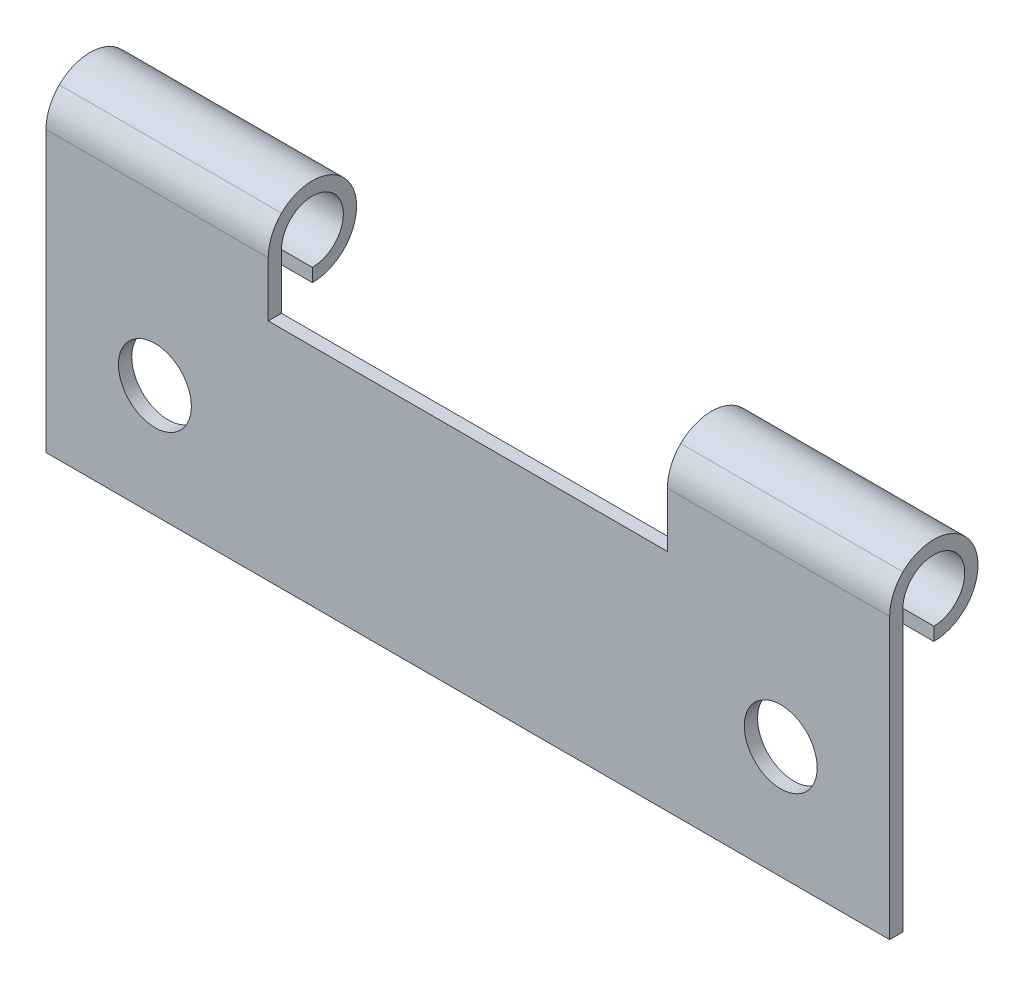
ISO-10303-21;
HEADER;
FILE_DESCRIPTION(('STEP AP214'),'2;1');
FILE_NAME('part.step','',(''),(''),'','','');
FILE_SCHEMA(('AUTOMOTIVE_DESIGN { 1 0 10303 214 1 1 1 1 }'));
ENDSEC;
DATA;
#1=APPLICATION_CONTEXT('core data for automotive mechanical design processes');
#2=APPLICATION_PROTOCOL_DEFINITION('international standard','automotive_design',2000,#1);
#3=PRODUCT_CONTEXT('',#1,'mechanical');
#4=PRODUCT('Part','Part','',(#3));
#5=PRODUCT_RELATED_PRODUCT_CATEGORY('part','',(#4));
#6=PRODUCT_DEFINITION_FORMATION('','',#4);
#7=PRODUCT_DEFINITION_CONTEXT('part definition',#1,'design');
#8=PRODUCT_DEFINITION('design','',#6,#7);
#9=PRODUCT_DEFINITION_SHAPE('','',#8);
#10=(LENGTH_UNIT() NAMED_UNIT(*) SI_UNIT(.MILLI.,.METRE.));
#11=(NAMED_UNIT(*) PLANE_ANGLE_UNIT() SI_UNIT($,.RADIAN.));
#12=(NAMED_UNIT(*) SI_UNIT($,.STERADIAN.) SOLID_ANGLE_UNIT());
#13=UNCERTAINTY_MEASURE_WITH_UNIT(LENGTH_MEASURE(1.E-05),#10,'distance_accuracy_value','');
#14=(GEOMETRIC_REPRESENTATION_CONTEXT(3) GLOBAL_UNCERTAINTY_ASSIGNED_CONTEXT((#13)) GLOBAL_UNIT_ASSIGNED_CONTEXT((#10,
#11,#12)) REPRESENTATION_CONTEXT('',''));
#15=CARTESIAN_POINT('',(0.,0.,0.));
#16=DIRECTION('',(0.,0.,1.));
#17=DIRECTION('',(1.,0.,0.));
#18=AXIS2_PLACEMENT_3D('',#15,#16,#17);
#19=CARTESIAN_POINT('',(0.,0.,0.));
#20=DIRECTION('',(0.,0.,1.));
#21=DIRECTION('',(1.,0.,0.));
#22=AXIS2_PLACEMENT_3D('',#19,#20,#21);
#23=PLANE('',#22);
#24=CARTESIAN_POINT('',(33.26,-5.095,0.));
#25=DIRECTION('',(0.,0.,-1.));
#26=DIRECTION('',(-1.,0.,0.));
#27=AXIS2_PLACEMENT_3D('',#24,#25,#26);
#28=CIRCLE('',#27,1.65);
#29=CARTESIAN_POINT('',(31.61,-5.095,0.));
#30=VERTEX_POINT('',#29);
#31=EDGE_CURVE('E189',#30,#30,#28,.T.);
#32=ORIENTED_EDGE('',*,*,#31,.F.);
#33=EDGE_LOOP('',(#32));
#34=FACE_BOUND('',#33,.T.);
#35=CARTESIAN_POINT('',(4.93,-5.095,0.));
#36=DIRECTION('',(0.,0.,-1.));
#37=DIRECTION('',(-1.,0.,0.));
#38=AXIS2_PLACEMENT_3D('',#35,#36,#37);
#39=CIRCLE('',#38,1.65);
#40=CARTESIAN_POINT('',(3.28,-5.095,0.));
#41=VERTEX_POINT('',#40);
#42=EDGE_CURVE('E194',#41,#41,#39,.T.);
#43=ORIENTED_EDGE('',*,*,#42,.F.);
#44=EDGE_LOOP('',(#43));
#45=FACE_BOUND('',#44,.T.);
#46=DIRECTION('',(0.,-1.,0.));
#47=VECTOR('',#46,1.);
#48=CARTESIAN_POINT('',(0.,0.,0.));
#49=LINE('',#48,#47);
#50=CARTESIAN_POINT('',(0.,2.5,0.));
#51=VERTEX_POINT('',#50);
#52=CARTESIAN_POINT('',(0.,-10.19,0.));
#53=VERTEX_POINT('',#52);
#54=EDGE_CURVE('E55',#51,#53,#49,.T.);
#55=ORIENTED_EDGE('',*,*,#54,.F.);
#56=DIRECTION('',(-1.,0.,0.));
#57=VECTOR('',#56,1.);
#58=CARTESIAN_POINT('',(15.7168542494924,2.5,0.));
#59=LINE('',#58,#57);
#60=CARTESIAN_POINT('',(10.06,2.5,0.));
#61=VERTEX_POINT('',#60);
#62=EDGE_CURVE('E223',#61,#51,#59,.T.);
#63=ORIENTED_EDGE('',*,*,#62,.F.);
#64=DIRECTION('',(0.,-1.,0.));
#65=VECTOR('',#64,1.);
#66=CARTESIAN_POINT('',(10.06,4.5,0.));
#67=LINE('',#66,#65);
#68=CARTESIAN_POINT('',(10.06,0.,0.));
#69=VERTEX_POINT('',#68);
#70=EDGE_CURVE('E262',#61,#69,#67,.T.);
#71=ORIENTED_EDGE('',*,*,#70,.T.);
#72=DIRECTION('',(-1.,0.,0.));
#73=VECTOR('',#72,1.);
#74=CARTESIAN_POINT('',(0.,0.,0.));
#75=LINE('',#74,#73);
#76=CARTESIAN_POINT('',(28.13,0.,0.));
#77=VERTEX_POINT('',#76);
#78=EDGE_CURVE('E184',#77,#69,#75,.T.);
#79=ORIENTED_EDGE('',*,*,#78,.F.);
#80=DIRECTION('',(0.,-1.,0.));
#81=VECTOR('',#80,1.);
#82=CARTESIAN_POINT('',(28.13,4.5,0.));
#83=LINE('',#82,#81);
#84=CARTESIAN_POINT('',(28.13,2.5,0.));
#85=VERTEX_POINT('',#84);
#86=EDGE_CURVE('E257',#85,#77,#83,.T.);
#87=ORIENTED_EDGE('',*,*,#86,.F.);
#88=DIRECTION('',(1.,0.,0.));
#89=VECTOR('',#88,1.);
#90=CARTESIAN_POINT('',(22.4731457505076,2.5,0.));
#91=LINE('',#90,#89);
#92=CARTESIAN_POINT('',(38.19,2.5,0.));
#93=VERTEX_POINT('',#92);
#94=EDGE_CURVE('E234',#85,#93,#91,.T.);
#95=ORIENTED_EDGE('',*,*,#94,.T.);
#96=DIRECTION('',(0.,1.,0.));
#97=VECTOR('',#96,1.);
#98=CARTESIAN_POINT('',(38.19,0.,0.));
#99=LINE('',#98,#97);
#100=CARTESIAN_POINT('',(38.19,-10.19,0.));
#101=VERTEX_POINT('',#100);
#102=EDGE_CURVE('E181',#101,#93,#99,.T.);
#103=ORIENTED_EDGE('',*,*,#102,.F.);
#104=DIRECTION('',(1.,0.,0.));
#105=VECTOR('',#104,1.);
#106=CARTESIAN_POINT('',(0.,-10.19,0.));
#107=LINE('',#106,#105);
#108=EDGE_CURVE('E178',#53,#101,#107,.T.);
#109=ORIENTED_EDGE('',*,*,#108,.F.);
#110=EDGE_LOOP('',(#55,#63,#71,#79,#87,#95,#103,#109));
#111=FACE_BOUND('',#110,.T.);
#112=ADVANCED_FACE('F38',(#34,#45,#111),#23,.F.);
#113=CARTESIAN_POINT('',(0.,0.,0.6));
#114=DIRECTION('',(0.,-1.,0.));
#115=DIRECTION('',(0.,0.,-1.));
#116=AXIS2_PLACEMENT_3D('',#113,#114,#115);
#117=PLANE('',#116);
#118=DIRECTION('',(0.,0.,1.));
#119=VECTOR('',#118,1.);
#120=CARTESIAN_POINT('',(28.13,0.,0.600000000000001));
#121=LINE('',#120,#119);
#122=CARTESIAN_POINT('',(28.13,0.,0.6));
#123=VERTEX_POINT('',#122);
#124=EDGE_CURVE('E252',#77,#123,#121,.T.);
#125=ORIENTED_EDGE('',*,*,#124,.F.);
#126=ORIENTED_EDGE('',*,*,#78,.T.);
#127=DIRECTION('',(0.,0.,-1.));
#128=VECTOR('',#127,1.);
#129=CARTESIAN_POINT('',(10.06,0.,0.));
#130=LINE('',#129,#128);
#131=CARTESIAN_POINT('',(10.06,0.,0.6));
#132=VERTEX_POINT('',#131);
#133=EDGE_CURVE('E259',#132,#69,#130,.T.);
#134=ORIENTED_EDGE('',*,*,#133,.F.);
#135=DIRECTION('',(-1.,0.,0.));
#136=VECTOR('',#135,1.);
#137=CARTESIAN_POINT('',(0.,0.,0.6));
#138=LINE('',#137,#136);
#139=EDGE_CURVE('E169',#123,#132,#138,.T.);
#140=ORIENTED_EDGE('',*,*,#139,.F.);
#141=EDGE_LOOP('',(#125,#126,#134,#140));
#142=FACE_BOUND('',#141,.T.);
#143=ADVANCED_FACE('F294',(#142),#117,.F.);
#144=CARTESIAN_POINT('',(0.,0.,0.6));
#145=DIRECTION('',(1.,0.,0.));
#146=DIRECTION('',(0.,0.,-1.));
#147=AXIS2_PLACEMENT_3D('',#144,#145,#146);
#148=PLANE('',#147);
#149=DIRECTION('',(0.,-1.,0.));
#150=VECTOR('',#149,1.);
#151=CARTESIAN_POINT('',(0.,0.,0.6));
#152=LINE('',#151,#150);
#153=CARTESIAN_POINT('',(0.,2.4766643901716,0.6));
#154=VERTEX_POINT('',#153);
#155=CARTESIAN_POINT('',(0.,-10.19,0.6));
#156=VERTEX_POINT('',#155);
#157=EDGE_CURVE('E173',#154,#156,#152,.T.);
#158=ORIENTED_EDGE('',*,*,#157,.F.);
#159=CARTESIAN_POINT('',(0.,2.4766643901716,-1.45600365471369));
#160=DIRECTION('',(1.,0.,0.));
#161=DIRECTION('',(0.,0.,-1.));
#162=AXIS2_PLACEMENT_3D('',#159,#160,#161);
#163=CIRCLE('',#162,2.05600365471369);
#164=CARTESIAN_POINT('',(0.,3.92828568570857,0.));
#165=VERTEX_POINT('',#164);
#166=EDGE_CURVE('E162',#165,#154,#163,.T.);
#167=ORIENTED_EDGE('',*,*,#166,.F.);
#168=CARTESIAN_POINT('',(0.,2.5,-1.4));
#169=DIRECTION('',(-1.,0.,0.));
#170=DIRECTION('',(0.,0.,1.));
#171=AXIS2_PLACEMENT_3D('',#168,#169,#170);
#172=CIRCLE('',#171,2.);
#173=CARTESIAN_POINT('',(0.,0.5,-1.4));
#174=VERTEX_POINT('',#173);
#175=EDGE_CURVE('E218',#165,#174,#172,.T.);
#176=ORIENTED_EDGE('',*,*,#175,.T.);
#177=DIRECTION('',(0.,-1.,0.));
#178=VECTOR('',#177,1.);
#179=CARTESIAN_POINT('',(0.,0.,-1.4));
#180=LINE('',#179,#178);
#181=CARTESIAN_POINT('',(0.,1.1,-1.4));
#182=VERTEX_POINT('',#181);
#183=EDGE_CURVE('E220',#182,#174,#180,.T.);
#184=ORIENTED_EDGE('',*,*,#183,.F.);
#185=CARTESIAN_POINT('',(0.,2.5,-1.4));
#186=DIRECTION('',(-1.,0.,0.));
#187=DIRECTION('',(0.,0.,1.));
#188=AXIS2_PLACEMENT_3D('',#185,#186,#187);
#189=CIRCLE('',#188,1.4);
#190=EDGE_CURVE('E204',#51,#182,#189,.T.);
#191=ORIENTED_EDGE('',*,*,#190,.F.);
#192=ORIENTED_EDGE('',*,*,#54,.T.);
#193=DIRECTION('',(0.,0.,-1.));
#194=VECTOR('',#193,1.);
#195=CARTESIAN_POINT('',(0.,-10.19,0.6));
#196=LINE('',#195,#194);
#197=EDGE_CURVE('E11',#156,#53,#196,.T.);
#198=ORIENTED_EDGE('',*,*,#197,.F.);
#199=EDGE_LOOP('',(#158,#167,#176,#184,#191,#192,#198));
#200=FACE_BOUND('',#199,.T.);
#201=ADVANCED_FACE('F40',(#200),#148,.F.);
#202=CARTESIAN_POINT('',(0.,-10.19,0.6));
#203=DIRECTION('',(0.,1.,0.));
#204=DIRECTION('',(0.,0.,1.));
#205=AXIS2_PLACEMENT_3D('',#202,#203,#204);
#206=PLANE('',#205);
#207=ORIENTED_EDGE('',*,*,#108,.T.);
#208=DIRECTION('',(0.,0.,-1.));
#209=VECTOR('',#208,1.);
#210=CARTESIAN_POINT('',(38.19,-10.19,0.6));
#211=LINE('',#210,#209);
#212=CARTESIAN_POINT('',(38.19,-10.19,0.6));
#213=VERTEX_POINT('',#212);
#214=EDGE_CURVE('E47',#213,#101,#211,.T.);
#215=ORIENTED_EDGE('',*,*,#214,.F.);
#216=DIRECTION('',(1.,0.,0.));
#217=VECTOR('',#216,1.);
#218=CARTESIAN_POINT('',(0.,-10.19,0.6));
#219=LINE('',#218,#217);
#220=EDGE_CURVE('E167',#156,#213,#219,.T.);
#221=ORIENTED_EDGE('',*,*,#220,.F.);
#222=ORIENTED_EDGE('',*,*,#197,.T.);
#223=EDGE_LOOP('',(#207,#215,#221,#222));
#224=FACE_BOUND('',#223,.T.);
#225=ADVANCED_FACE('F270',(#224),#206,.F.);
#226=CARTESIAN_POINT('',(38.19,0.,0.6));
#227=DIRECTION('',(-1.,0.,0.));
#228=DIRECTION('',(0.,0.,1.));
#229=AXIS2_PLACEMENT_3D('',#226,#227,#228);
#230=PLANE('',#229);
#231=CARTESIAN_POINT('',(38.19,2.5,-1.4));
#232=DIRECTION('',(1.,0.,0.));
#233=DIRECTION('',(0.,0.,-1.));
#234=AXIS2_PLACEMENT_3D('',#231,#232,#233);
#235=CIRCLE('',#234,2.);
#236=CARTESIAN_POINT('',(38.19,0.5,-1.4));
#237=VERTEX_POINT('',#236);
#238=CARTESIAN_POINT('',(38.19,3.92828568570857,0.));
#239=VERTEX_POINT('',#238);
#240=EDGE_CURVE('E161',#237,#239,#235,.T.);
#241=ORIENTED_EDGE('',*,*,#240,.T.);
#242=CARTESIAN_POINT('',(38.19,2.4766643901716,-1.45600365471369));
#243=DIRECTION('',(1.,0.,0.));
#244=DIRECTION('',(0.,0.,-1.));
#245=AXIS2_PLACEMENT_3D('',#242,#243,#244);
#246=CIRCLE('',#245,2.05600365471369);
#247=CARTESIAN_POINT('',(38.19,2.4766643901716,0.6));
#248=VERTEX_POINT('',#247);
#249=EDGE_CURVE('E144',#239,#248,#246,.T.);
#250=ORIENTED_EDGE('',*,*,#249,.T.);
#251=DIRECTION('',(0.,1.,0.));
#252=VECTOR('',#251,1.);
#253=CARTESIAN_POINT('',(38.19,0.,0.6));
#254=LINE('',#253,#252);
#255=EDGE_CURVE('E158',#213,#248,#254,.T.);
#256=ORIENTED_EDGE('',*,*,#255,.F.);
#257=ORIENTED_EDGE('',*,*,#214,.T.);
#258=ORIENTED_EDGE('',*,*,#102,.T.);
#259=CARTESIAN_POINT('',(38.19,2.5,-1.4));
#260=DIRECTION('',(-1.,0.,0.));
#261=DIRECTION('',(0.,0.,-1.));
#262=AXIS2_PLACEMENT_3D('',#259,#260,#261);
#263=CIRCLE('',#262,1.4);
#264=CARTESIAN_POINT('',(38.19,1.1,-1.4));
#265=VERTEX_POINT('',#264);
#266=EDGE_CURVE('E230',#93,#265,#263,.T.);
#267=ORIENTED_EDGE('',*,*,#266,.T.);
#268=DIRECTION('',(0.,-1.,0.));
#269=VECTOR('',#268,1.);
#270=CARTESIAN_POINT('',(38.19,1.1,-1.4));
#271=LINE('',#270,#269);
#272=EDGE_CURVE('E240',#265,#237,#271,.T.);
#273=ORIENTED_EDGE('',*,*,#272,.T.);
#274=EDGE_LOOP('',(#241,#250,#256,#257,#258,#267,#273));
#275=FACE_BOUND('',#274,.T.);
#276=ADVANCED_FACE('F156',(#275),#230,.F.);
#277=CARTESIAN_POINT('',(0.,0.,0.6));
#278=DIRECTION('',(0.,0.,1.));
#279=DIRECTION('',(1.,0.,0.));
#280=AXIS2_PLACEMENT_3D('',#277,#278,#279);
#281=PLANE('',#280);
#282=CARTESIAN_POINT('',(33.26,-5.095,0.6));
#283=DIRECTION('',(0.,0.,1.));
#284=DIRECTION('',(1.,0.,0.));
#285=AXIS2_PLACEMENT_3D('',#282,#283,#284);
#286=CIRCLE('',#285,1.65);
#287=CARTESIAN_POINT('',(34.91,-5.095,0.6));
#288=VERTEX_POINT('',#287);
#289=EDGE_CURVE('E42',#288,#288,#286,.T.);
#290=ORIENTED_EDGE('',*,*,#289,.F.);
#291=EDGE_LOOP('',(#290));
#292=FACE_BOUND('',#291,.T.);
#293=CARTESIAN_POINT('',(4.93,-5.095,0.6));
#294=DIRECTION('',(0.,0.,1.));
#295=DIRECTION('',(1.,0.,0.));
#296=AXIS2_PLACEMENT_3D('',#293,#294,#295);
#297=CIRCLE('',#296,1.65);
#298=CARTESIAN_POINT('',(6.58,-5.095,0.6));
#299=VERTEX_POINT('',#298);
#300=EDGE_CURVE('E187',#299,#299,#297,.T.);
#301=ORIENTED_EDGE('',*,*,#300,.F.);
#302=EDGE_LOOP('',(#301));
#303=FACE_BOUND('',#302,.T.);
#304=DIRECTION('',(-1.,0.,0.));
#305=VECTOR('',#304,1.);
#306=CARTESIAN_POINT('',(38.19,2.4766643901716,0.6));
#307=LINE('',#306,#305);
#308=CARTESIAN_POINT('',(10.06,2.4766643901716,0.6));
#309=VERTEX_POINT('',#308);
#310=EDGE_CURVE('E151',#309,#154,#307,.T.);
#311=ORIENTED_EDGE('',*,*,#310,.T.);
#312=ORIENTED_EDGE('',*,*,#157,.T.);
#313=ORIENTED_EDGE('',*,*,#220,.T.);
#314=ORIENTED_EDGE('',*,*,#255,.T.);
#315=CARTESIAN_POINT('',(28.13,2.4766643901716,0.6));
#316=VERTEX_POINT('',#315);
#317=EDGE_CURVE('E141',#248,#316,#307,.T.);
#318=ORIENTED_EDGE('',*,*,#317,.T.);
#319=DIRECTION('',(0.,-1.,0.));
#320=VECTOR('',#319,1.);
#321=CARTESIAN_POINT('',(28.13,4.5,0.600000000000001));
#322=LINE('',#321,#320);
#323=EDGE_CURVE('E255',#316,#123,#322,.T.);
#324=ORIENTED_EDGE('',*,*,#323,.T.);
#325=ORIENTED_EDGE('',*,*,#139,.T.);
#326=DIRECTION('',(0.,-1.,0.));
#327=VECTOR('',#326,1.);
#328=CARTESIAN_POINT('',(10.06,4.5,0.6));
#329=LINE('',#328,#327);
#330=EDGE_CURVE('E179',#309,#132,#329,.T.);
#331=ORIENTED_EDGE('',*,*,#330,.F.);
#332=EDGE_LOOP('',(#311,#312,#313,#314,#318,#324,#325,#331));
#333=FACE_BOUND('',#332,.T.);
#334=ADVANCED_FACE('F165',(#292,#303,#333),#281,.T.);
#335=CARTESIAN_POINT('',(10.06,4.5,0.));
#336=DIRECTION('',(-1.,0.,0.));
#337=DIRECTION('',(0.,0.,1.));
#338=AXIS2_PLACEMENT_3D('',#335,#336,#337);
#339=PLANE('',#338);
#340=CARTESIAN_POINT('',(10.06,2.5,-1.4));
#341=DIRECTION('',(-1.,0.,0.));
#342=DIRECTION('',(0.,0.,1.));
#343=AXIS2_PLACEMENT_3D('',#340,#341,#342);
#344=CIRCLE('',#343,2.);
#345=CARTESIAN_POINT('',(10.06,0.5,-1.4));
#346=VERTEX_POINT('',#345);
#347=CARTESIAN_POINT('',(10.06,3.92828568570857,0.));
#348=VERTEX_POINT('',#347);
#349=EDGE_CURVE('E205',#346,#348,#344,.F.);
#350=ORIENTED_EDGE('',*,*,#349,.T.);
#351=CARTESIAN_POINT('',(10.06,2.4766643901716,-1.45600365471369));
#352=DIRECTION('',(-1.,0.,0.));
#353=DIRECTION('',(0.,0.,1.));
#354=AXIS2_PLACEMENT_3D('',#351,#352,#353);
#355=CIRCLE('',#354,2.05600365471369);
#356=EDGE_CURVE('E63',#348,#309,#355,.F.);
#357=ORIENTED_EDGE('',*,*,#356,.T.);
#358=ORIENTED_EDGE('',*,*,#330,.T.);
#359=ORIENTED_EDGE('',*,*,#133,.T.);
#360=ORIENTED_EDGE('',*,*,#70,.F.);
#361=CARTESIAN_POINT('',(10.06,2.5,-1.4));
#362=DIRECTION('',(-1.,0.,0.));
#363=DIRECTION('',(0.,0.,1.));
#364=AXIS2_PLACEMENT_3D('',#361,#362,#363);
#365=CIRCLE('',#364,1.4);
#366=CARTESIAN_POINT('',(10.06,1.1,-1.4));
#367=VERTEX_POINT('',#366);
#368=EDGE_CURVE('E212',#367,#61,#365,.F.);
#369=ORIENTED_EDGE('',*,*,#368,.F.);
#370=DIRECTION('',(0.,1.,0.));
#371=VECTOR('',#370,1.);
#372=CARTESIAN_POINT('',(10.06,0.,-1.4));
#373=LINE('',#372,#371);
#374=EDGE_CURVE('E208',#346,#367,#373,.T.);
#375=ORIENTED_EDGE('',*,*,#374,.F.);
#376=EDGE_LOOP('',(#350,#357,#358,#359,#360,#369,#375));
#377=FACE_BOUND('',#376,.T.);
#378=ADVANCED_FACE('F296',(#377),#339,.F.);
#379=CARTESIAN_POINT('',(28.13,4.5,0.600000000000001));
#380=DIRECTION('',(1.,0.,0.));
#381=DIRECTION('',(0.,0.,-1.));
#382=AXIS2_PLACEMENT_3D('',#379,#380,#381);
#383=PLANE('',#382);
#384=ORIENTED_EDGE('',*,*,#323,.F.);
#385=CARTESIAN_POINT('',(28.13,2.4766643901716,-1.45600365471369));
#386=DIRECTION('',(1.,0.,0.));
#387=DIRECTION('',(0.,0.,-1.));
#388=AXIS2_PLACEMENT_3D('',#385,#386,#387);
#389=CIRCLE('',#388,2.05600365471369);
#390=CARTESIAN_POINT('',(28.13,3.92828568570857,0.));
#391=VERTEX_POINT('',#390);
#392=EDGE_CURVE('E147',#316,#391,#389,.F.);
#393=ORIENTED_EDGE('',*,*,#392,.T.);
#394=CARTESIAN_POINT('',(28.13,2.5,-1.4));
#395=DIRECTION('',(1.,0.,0.));
#396=DIRECTION('',(0.,0.,-1.));
#397=AXIS2_PLACEMENT_3D('',#394,#395,#396);
#398=CIRCLE('',#397,2.);
#399=CARTESIAN_POINT('',(28.13,0.5,-1.4));
#400=VERTEX_POINT('',#399);
#401=EDGE_CURVE('E231',#391,#400,#398,.F.);
#402=ORIENTED_EDGE('',*,*,#401,.T.);
#403=DIRECTION('',(0.,1.,0.));
#404=VECTOR('',#403,1.);
#405=CARTESIAN_POINT('',(28.13,1.1,-1.4));
#406=LINE('',#405,#404);
#407=CARTESIAN_POINT('',(28.13,1.1,-1.4));
#408=VERTEX_POINT('',#407);
#409=EDGE_CURVE('E237',#400,#408,#406,.T.);
#410=ORIENTED_EDGE('',*,*,#409,.T.);
#411=CARTESIAN_POINT('',(28.13,2.5,-1.4));
#412=DIRECTION('',(1.,0.,0.));
#413=DIRECTION('',(0.,0.,-1.));
#414=AXIS2_PLACEMENT_3D('',#411,#412,#413);
#415=CIRCLE('',#414,1.4);
#416=EDGE_CURVE('E233',#408,#85,#415,.T.);
#417=ORIENTED_EDGE('',*,*,#416,.T.);
#418=ORIENTED_EDGE('',*,*,#86,.T.);
#419=ORIENTED_EDGE('',*,*,#124,.T.);
#420=EDGE_LOOP('',(#384,#393,#402,#410,#417,#418,#419));
#421=FACE_BOUND('',#420,.T.);
#422=ADVANCED_FACE('F283',(#421),#383,.F.);
#423=CARTESIAN_POINT('',(22.4731457505076,2.5,-1.4));
#424=DIRECTION('',(1.,0.,0.));
#425=DIRECTION('',(0.,0.,-1.));
#426=AXIS2_PLACEMENT_3D('',#423,#424,#425);
#427=CYLINDRICAL_SURFACE('',#426,2.);
#428=DIRECTION('',(1.,0.,0.));
#429=VECTOR('',#428,1.);
#430=CARTESIAN_POINT('',(22.4731457505076,3.92828568570857,0.));
#431=LINE('',#430,#429);
#432=EDGE_CURVE('E250',#239,#391,#431,.F.);
#433=ORIENTED_EDGE('',*,*,#432,.F.);
#434=ORIENTED_EDGE('',*,*,#240,.F.);
#435=DIRECTION('',(1.,0.,0.));
#436=VECTOR('',#435,1.);
#437=CARTESIAN_POINT('',(22.4731457505076,0.5,-1.4));
#438=LINE('',#437,#436);
#439=EDGE_CURVE('E246',#400,#237,#438,.T.);
#440=ORIENTED_EDGE('',*,*,#439,.F.);
#441=ORIENTED_EDGE('',*,*,#401,.F.);
#442=EDGE_LOOP('',(#433,#434,#440,#441));
#443=FACE_BOUND('',#442,.T.);
#444=ADVANCED_FACE('F290',(#443),#427,.T.);
#445=CARTESIAN_POINT('',(22.4731457505076,2.5,-1.4));
#446=DIRECTION('',(1.,0.,0.));
#447=DIRECTION('',(0.,0.,-1.));
#448=AXIS2_PLACEMENT_3D('',#445,#446,#447);
#449=CYLINDRICAL_SURFACE('',#448,1.4);
#450=ORIENTED_EDGE('',*,*,#416,.F.);
#451=DIRECTION('',(1.,0.,0.));
#452=VECTOR('',#451,1.);
#453=CARTESIAN_POINT('',(22.4731457505076,1.1,-1.4));
#454=LINE('',#453,#452);
#455=EDGE_CURVE('E243',#408,#265,#454,.T.);
#456=ORIENTED_EDGE('',*,*,#455,.T.);
#457=ORIENTED_EDGE('',*,*,#266,.F.);
#458=ORIENTED_EDGE('',*,*,#94,.F.);
#459=EDGE_LOOP('',(#450,#456,#457,#458));
#460=FACE_BOUND('',#459,.T.);
#461=ADVANCED_FACE('F277',(#460),#449,.F.);
#462=CARTESIAN_POINT('',(22.4731457505076,1.1,-1.4));
#463=DIRECTION('',(0.,0.,1.));
#464=DIRECTION('',(1.,0.,0.));
#465=AXIS2_PLACEMENT_3D('',#462,#463,#464);
#466=PLANE('',#465);
#467=ORIENTED_EDGE('',*,*,#409,.F.);
#468=ORIENTED_EDGE('',*,*,#439,.T.);
#469=ORIENTED_EDGE('',*,*,#272,.F.);
#470=ORIENTED_EDGE('',*,*,#455,.F.);
#471=EDGE_LOOP('',(#467,#468,#469,#470));
#472=FACE_BOUND('',#471,.T.);
#473=ADVANCED_FACE('F286',(#472),#466,.T.);
#474=CARTESIAN_POINT('',(15.7168542494924,2.5,-1.4));
#475=DIRECTION('',(-1.,0.,0.));
#476=DIRECTION('',(0.,0.,1.));
#477=AXIS2_PLACEMENT_3D('',#474,#475,#476);
#478=CYLINDRICAL_SURFACE('',#477,2.);
#479=DIRECTION('',(-1.,0.,0.));
#480=VECTOR('',#479,1.);
#481=CARTESIAN_POINT('',(15.7168542494924,3.92828568570857,0.));
#482=LINE('',#481,#480);
#483=EDGE_CURVE('E215',#348,#165,#482,.T.);
#484=ORIENTED_EDGE('',*,*,#483,.F.);
#485=ORIENTED_EDGE('',*,*,#349,.F.);
#486=DIRECTION('',(-1.,0.,0.));
#487=VECTOR('',#486,1.);
#488=CARTESIAN_POINT('',(15.7168542494924,0.5,-1.4));
#489=LINE('',#488,#487);
#490=EDGE_CURVE('E225',#346,#174,#489,.T.);
#491=ORIENTED_EDGE('',*,*,#490,.T.);
#492=ORIENTED_EDGE('',*,*,#175,.F.);
#493=EDGE_LOOP('',(#484,#485,#491,#492));
#494=FACE_BOUND('',#493,.T.);
#495=ADVANCED_FACE('F300',(#494),#478,.T.);
#496=CARTESIAN_POINT('',(15.7168542494924,2.5,-1.4));
#497=DIRECTION('',(-1.,0.,0.));
#498=DIRECTION('',(0.,0.,1.));
#499=AXIS2_PLACEMENT_3D('',#496,#497,#498);
#500=CYLINDRICAL_SURFACE('',#499,1.4);
#501=DIRECTION('',(-1.,0.,0.));
#502=VECTOR('',#501,1.);
#503=CARTESIAN_POINT('',(15.7168542494924,1.1,-1.4));
#504=LINE('',#503,#502);
#505=EDGE_CURVE('E209',#367,#182,#504,.T.);
#506=ORIENTED_EDGE('',*,*,#505,.F.);
#507=ORIENTED_EDGE('',*,*,#368,.T.);
#508=ORIENTED_EDGE('',*,*,#62,.T.);
#509=ORIENTED_EDGE('',*,*,#190,.T.);
#510=EDGE_LOOP('',(#506,#507,#508,#509));
#511=FACE_BOUND('',#510,.T.);
#512=ADVANCED_FACE('F306',(#511),#500,.F.);
#513=CARTESIAN_POINT('',(15.7168542494924,0.,-1.4));
#514=DIRECTION('',(0.,0.,-1.));
#515=DIRECTION('',(0.,1.,0.));
#516=AXIS2_PLACEMENT_3D('',#513,#514,#515);
#517=PLANE('',#516);
#518=ORIENTED_EDGE('',*,*,#490,.F.);
#519=ORIENTED_EDGE('',*,*,#374,.T.);
#520=ORIENTED_EDGE('',*,*,#505,.T.);
#521=ORIENTED_EDGE('',*,*,#183,.T.);
#522=EDGE_LOOP('',(#518,#519,#520,#521));
#523=FACE_BOUND('',#522,.T.);
#524=ADVANCED_FACE('F303',(#523),#517,.F.);
#525=CARTESIAN_POINT('',(38.19,2.4766643901716,-1.45600365471369));
#526=DIRECTION('',(-1.,0.,0.));
#527=DIRECTION('',(0.,0.,1.));
#528=AXIS2_PLACEMENT_3D('',#525,#526,#527);
#529=CYLINDRICAL_SURFACE('',#528,2.05600365471369);
#530=ORIENTED_EDGE('',*,*,#483,.T.);
#531=ORIENTED_EDGE('',*,*,#166,.T.);
#532=ORIENTED_EDGE('',*,*,#310,.F.);
#533=ORIENTED_EDGE('',*,*,#356,.F.);
#534=EDGE_LOOP('',(#530,#531,#532,#533));
#535=FACE_BOUND('',#534,.T.);
#536=ADVANCED_FACE('F313',(#535),#529,.T.);
#537=ORIENTED_EDGE('',*,*,#317,.F.);
#538=ORIENTED_EDGE('',*,*,#249,.F.);
#539=ORIENTED_EDGE('',*,*,#432,.T.);
#540=ORIENTED_EDGE('',*,*,#392,.F.);
#541=EDGE_LOOP('',(#537,#538,#539,#540));
#542=FACE_BOUND('',#541,.T.);
#543=ADVANCED_FACE('F143',(#542),#529,.T.);
#544=CARTESIAN_POINT('',(4.93,-5.095,10.01));
#545=DIRECTION('',(0.,0.,-1.));
#546=DIRECTION('',(-1.,0.,0.));
#547=AXIS2_PLACEMENT_3D('',#544,#545,#546);
#548=CYLINDRICAL_SURFACE('',#547,1.65);
#549=ORIENTED_EDGE('',*,*,#300,.T.);
#550=EDGE_LOOP('',(#549));
#551=FACE_BOUND('',#550,.T.);
#552=ORIENTED_EDGE('',*,*,#42,.T.);
#553=EDGE_LOOP('',(#552));
#554=FACE_BOUND('',#553,.T.);
#555=ADVANCED_FACE('F390',(#551,#554),#548,.F.);
#556=CARTESIAN_POINT('',(33.26,-5.095,10.01));
#557=DIRECTION('',(0.,0.,-1.));
#558=DIRECTION('',(-1.,0.,0.));
#559=AXIS2_PLACEMENT_3D('',#556,#557,#558);
#560=CYLINDRICAL_SURFACE('',#559,1.65);
#561=ORIENTED_EDGE('',*,*,#289,.T.);
#562=EDGE_LOOP('',(#561));
#563=FACE_BOUND('',#562,.T.);
#564=ORIENTED_EDGE('',*,*,#31,.T.);
#565=EDGE_LOOP('',(#564));
#566=FACE_BOUND('',#565,.T.);
#567=ADVANCED_FACE('F396',(#563,#566),#560,.F.);
#568=CLOSED_SHELL('',(#112,#143,#201,#225,#276,#334,#378,#422,#444,#461,#473,#495,#512,#524,
#536,#543,#555,#567));
#569=MANIFOLD_SOLID_BREP('B2',#568);
#570=ADVANCED_BREP_SHAPE_REPRESENTATION('',(#18,#569),#14);
#571=SHAPE_DEFINITION_REPRESENTATION(#9,#570);
ENDSEC;
END-ISO-10303-21;
